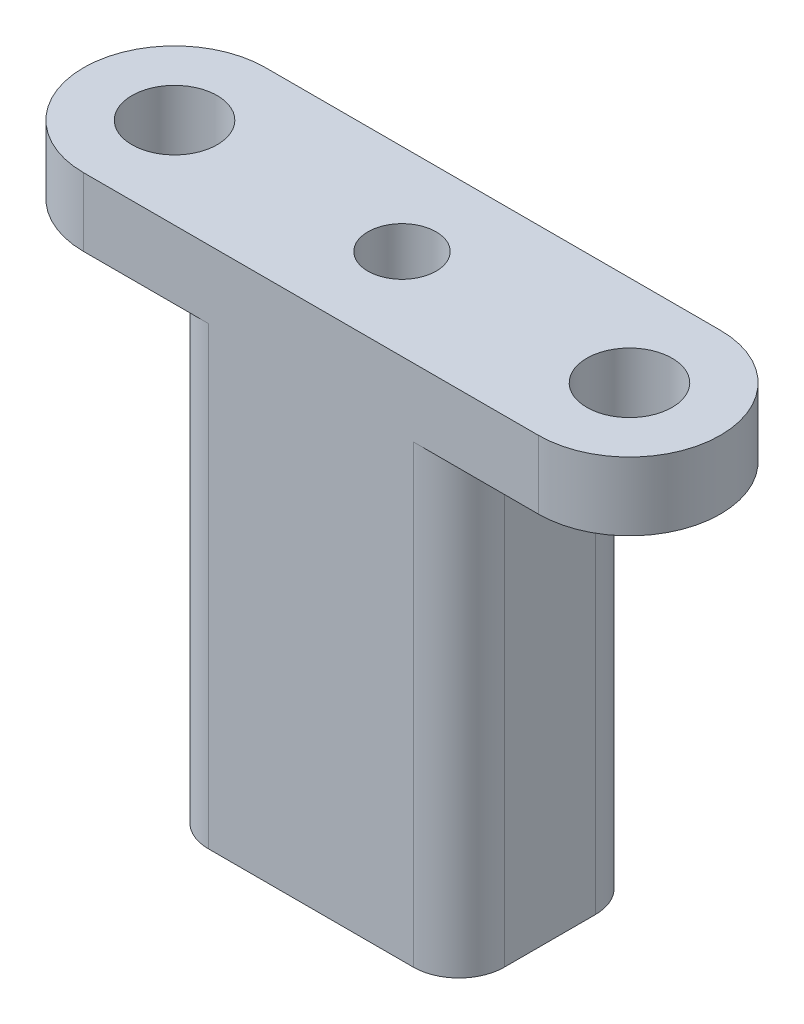
ISO-10303-21;
HEADER;
FILE_DESCRIPTION(('STEP AP214'),'2;1');
FILE_NAME('part.step','',(''),(''),'','','');
FILE_SCHEMA(('AUTOMOTIVE_DESIGN { 1 0 10303 214 1 1 1 1 }'));
ENDSEC;
DATA;
#1=APPLICATION_CONTEXT('core data for automotive mechanical design processes');
#2=APPLICATION_PROTOCOL_DEFINITION('international standard','automotive_design',2000,#1);
#3=PRODUCT_CONTEXT('',#1,'mechanical');
#4=PRODUCT('Part','Part','',(#3));
#5=PRODUCT_RELATED_PRODUCT_CATEGORY('part','',(#4));
#6=PRODUCT_DEFINITION_FORMATION('','',#4);
#7=PRODUCT_DEFINITION_CONTEXT('part definition',#1,'design');
#8=PRODUCT_DEFINITION('design','',#6,#7);
#9=PRODUCT_DEFINITION_SHAPE('','',#8);
#10=(LENGTH_UNIT() NAMED_UNIT(*) SI_UNIT(.MILLI.,.METRE.));
#11=(NAMED_UNIT(*) PLANE_ANGLE_UNIT() SI_UNIT($,.RADIAN.));
#12=(NAMED_UNIT(*) SI_UNIT($,.STERADIAN.) SOLID_ANGLE_UNIT());
#13=UNCERTAINTY_MEASURE_WITH_UNIT(LENGTH_MEASURE(1.E-05),#10,'distance_accuracy_value','');
#14=(GEOMETRIC_REPRESENTATION_CONTEXT(3) GLOBAL_UNCERTAINTY_ASSIGNED_CONTEXT((#13)) GLOBAL_UNIT_ASSIGNED_CONTEXT((#10,
#11,#12)) REPRESENTATION_CONTEXT('',''));
#15=CARTESIAN_POINT('',(0.,0.,0.));
#16=DIRECTION('',(0.,0.,1.));
#17=DIRECTION('',(1.,0.,0.));
#18=AXIS2_PLACEMENT_3D('',#15,#16,#17);
#19=CARTESIAN_POINT('',(9.99999999999999,0.,0.));
#20=DIRECTION('',(0.,1.,0.));
#21=DIRECTION('',(0.,0.,1.));
#22=AXIS2_PLACEMENT_3D('',#19,#20,#21);
#23=PLANE('',#22);
#24=CARTESIAN_POINT('',(9.99999999999999,0.,0.));
#25=DIRECTION('',(0.,1.,0.));
#26=DIRECTION('',(0.,0.,1.));
#27=AXIS2_PLACEMENT_3D('',#24,#25,#26);
#28=CIRCLE('',#27,1.875);
#29=CARTESIAN_POINT('',(9.99999999999999,0.,1.875));
#30=VERTEX_POINT('',#29);
#31=EDGE_CURVE('E211',#30,#30,#28,.T.);
#32=ORIENTED_EDGE('',*,*,#31,.T.);
#33=EDGE_LOOP('',(#32));
#34=FACE_BOUND('',#33,.T.);
#35=DIRECTION('',(0.,0.,1.));
#36=VECTOR('',#35,1.);
#37=CARTESIAN_POINT('',(6.5,0.,-4.));
#38=LINE('',#37,#36);
#39=CARTESIAN_POINT('',(6.5,0.,-2.));
#40=VERTEX_POINT('',#39);
#41=CARTESIAN_POINT('',(6.5,0.,2.));
#42=VERTEX_POINT('',#41);
#43=EDGE_CURVE('E190',#40,#42,#38,.T.);
#44=ORIENTED_EDGE('',*,*,#43,.F.);
#45=CARTESIAN_POINT('',(4.5,0.,-2.));
#46=DIRECTION('',(0.,1.,0.));
#47=DIRECTION('',(0.,0.,1.));
#48=AXIS2_PLACEMENT_3D('',#45,#46,#47);
#49=CIRCLE('',#48,2.);
#50=CARTESIAN_POINT('',(4.5,0.,-4.));
#51=VERTEX_POINT('',#50);
#52=EDGE_CURVE('E45',#40,#51,#49,.T.);
#53=ORIENTED_EDGE('',*,*,#52,.T.);
#54=DIRECTION('',(-1.,0.,0.));
#55=VECTOR('',#54,1.);
#56=CARTESIAN_POINT('',(-10.,0.,-4.));
#57=LINE('',#56,#55);
#58=CARTESIAN_POINT('',(9.99999999999999,0.,-4.));
#59=VERTEX_POINT('',#58);
#60=EDGE_CURVE('E52',#59,#51,#57,.T.);
#61=ORIENTED_EDGE('',*,*,#60,.F.);
#62=CARTESIAN_POINT('',(9.99999999999999,0.,0.));
#63=DIRECTION('',(0.,1.,0.));
#64=DIRECTION('',(0.,0.,1.));
#65=AXIS2_PLACEMENT_3D('',#62,#63,#64);
#66=CIRCLE('',#65,4.);
#67=CARTESIAN_POINT('',(9.99999999999999,0.,4.));
#68=VERTEX_POINT('',#67);
#69=EDGE_CURVE('E148',#68,#59,#66,.T.);
#70=ORIENTED_EDGE('',*,*,#69,.F.);
#71=DIRECTION('',(1.,0.,0.));
#72=VECTOR('',#71,1.);
#73=CARTESIAN_POINT('',(-10.,0.,4.));
#74=LINE('',#73,#72);
#75=CARTESIAN_POINT('',(4.5,0.,4.));
#76=VERTEX_POINT('',#75);
#77=EDGE_CURVE('E241',#76,#68,#74,.T.);
#78=ORIENTED_EDGE('',*,*,#77,.F.);
#79=CARTESIAN_POINT('',(4.5,0.,2.));
#80=DIRECTION('',(0.,1.,0.));
#81=DIRECTION('',(0.,0.,1.));
#82=AXIS2_PLACEMENT_3D('',#79,#80,#81);
#83=CIRCLE('',#82,2.);
#84=EDGE_CURVE('E185',#76,#42,#83,.T.);
#85=ORIENTED_EDGE('',*,*,#84,.T.);
#86=EDGE_LOOP('',(#44,#53,#61,#70,#78,#85));
#87=FACE_BOUND('',#86,.T.);
#88=ADVANCED_FACE('F37',(#34,#87),#23,.F.);
#89=CARTESIAN_POINT('',(-10.,0.,0.));
#90=DIRECTION('',(0.,1.,0.));
#91=DIRECTION('',(0.,0.,1.));
#92=AXIS2_PLACEMENT_3D('',#89,#90,#91);
#93=CIRCLE('',#92,1.875);
#94=CARTESIAN_POINT('',(-10.,0.,1.875));
#95=VERTEX_POINT('',#94);
#96=EDGE_CURVE('E226',#95,#95,#93,.T.);
#97=ORIENTED_EDGE('',*,*,#96,.T.);
#98=EDGE_LOOP('',(#97));
#99=FACE_BOUND('',#98,.T.);
#100=DIRECTION('',(0.,0.,-1.));
#101=VECTOR('',#100,1.);
#102=CARTESIAN_POINT('',(-6.5,0.,-4.));
#103=LINE('',#102,#101);
#104=CARTESIAN_POINT('',(-6.5,0.,2.));
#105=VERTEX_POINT('',#104);
#106=CARTESIAN_POINT('',(-6.5,0.,-2.));
#107=VERTEX_POINT('',#106);
#108=EDGE_CURVE('E218',#105,#107,#103,.T.);
#109=ORIENTED_EDGE('',*,*,#108,.F.);
#110=CARTESIAN_POINT('',(-4.5,0.,2.));
#111=DIRECTION('',(0.,1.,0.));
#112=DIRECTION('',(0.,0.,1.));
#113=AXIS2_PLACEMENT_3D('',#110,#111,#112);
#114=CIRCLE('',#113,2.);
#115=CARTESIAN_POINT('',(-4.5,0.,4.));
#116=VERTEX_POINT('',#115);
#117=EDGE_CURVE('E182',#105,#116,#114,.T.);
#118=ORIENTED_EDGE('',*,*,#117,.T.);
#119=CARTESIAN_POINT('',(-10.,0.,4.));
#120=VERTEX_POINT('',#119);
#121=EDGE_CURVE('E144',#120,#116,#74,.T.);
#122=ORIENTED_EDGE('',*,*,#121,.F.);
#123=CARTESIAN_POINT('',(-10.,0.,0.));
#124=DIRECTION('',(0.,1.,0.));
#125=DIRECTION('',(0.,0.,-1.));
#126=AXIS2_PLACEMENT_3D('',#123,#124,#125);
#127=CIRCLE('',#126,4.);
#128=CARTESIAN_POINT('',(-10.,0.,-4.));
#129=VERTEX_POINT('',#128);
#130=EDGE_CURVE('E239',#129,#120,#127,.T.);
#131=ORIENTED_EDGE('',*,*,#130,.F.);
#132=CARTESIAN_POINT('',(-4.5,0.,-4.));
#133=VERTEX_POINT('',#132);
#134=EDGE_CURVE('E59',#133,#129,#57,.T.);
#135=ORIENTED_EDGE('',*,*,#134,.F.);
#136=CARTESIAN_POINT('',(-4.5,0.,-2.));
#137=DIRECTION('',(0.,1.,0.));
#138=DIRECTION('',(0.,0.,1.));
#139=AXIS2_PLACEMENT_3D('',#136,#137,#138);
#140=CIRCLE('',#139,2.);
#141=EDGE_CURVE('E11',#133,#107,#140,.T.);
#142=ORIENTED_EDGE('',*,*,#141,.T.);
#143=EDGE_LOOP('',(#109,#118,#122,#131,#135,#142));
#144=FACE_BOUND('',#143,.T.);
#145=ADVANCED_FACE('F250',(#99,#144),#23,.F.);
#146=CARTESIAN_POINT('',(9.99999999999999,3.,0.));
#147=DIRECTION('',(0.,1.,0.));
#148=DIRECTION('',(0.,0.,1.));
#149=AXIS2_PLACEMENT_3D('',#146,#147,#148);
#150=PLANE('',#149);
#151=CARTESIAN_POINT('',(9.99999999999999,3.,0.));
#152=DIRECTION('',(0.,1.,0.));
#153=DIRECTION('',(0.,0.,1.));
#154=AXIS2_PLACEMENT_3D('',#151,#152,#153);
#155=CIRCLE('',#154,1.875);
#156=CARTESIAN_POINT('',(9.99999999999999,3.,1.875));
#157=VERTEX_POINT('',#156);
#158=EDGE_CURVE('E223',#157,#157,#155,.T.);
#159=ORIENTED_EDGE('',*,*,#158,.F.);
#160=EDGE_LOOP('',(#159));
#161=FACE_BOUND('',#160,.T.);
#162=CARTESIAN_POINT('',(9.99999999999999,3.,0.));
#163=DIRECTION('',(0.,1.,0.));
#164=DIRECTION('',(0.,0.,1.));
#165=AXIS2_PLACEMENT_3D('',#162,#163,#164);
#166=CIRCLE('',#165,4.);
#167=CARTESIAN_POINT('',(9.99999999999999,3.,4.));
#168=VERTEX_POINT('',#167);
#169=CARTESIAN_POINT('',(9.99999999999999,3.,-4.));
#170=VERTEX_POINT('',#169);
#171=EDGE_CURVE('E134',#168,#170,#166,.T.);
#172=ORIENTED_EDGE('',*,*,#171,.T.);
#173=DIRECTION('',(-1.,0.,0.));
#174=VECTOR('',#173,1.);
#175=CARTESIAN_POINT('',(-10.,3.,-4.));
#176=LINE('',#175,#174);
#177=CARTESIAN_POINT('',(-10.,3.,-4.));
#178=VERTEX_POINT('',#177);
#179=EDGE_CURVE('E123',#170,#178,#176,.T.);
#180=ORIENTED_EDGE('',*,*,#179,.T.);
#181=CARTESIAN_POINT('',(-10.,3.,0.));
#182=DIRECTION('',(0.,1.,0.));
#183=DIRECTION('',(0.,0.,-1.));
#184=AXIS2_PLACEMENT_3D('',#181,#182,#183);
#185=CIRCLE('',#184,4.);
#186=CARTESIAN_POINT('',(-10.,3.,4.));
#187=VERTEX_POINT('',#186);
#188=EDGE_CURVE('E133',#178,#187,#185,.T.);
#189=ORIENTED_EDGE('',*,*,#188,.T.);
#190=DIRECTION('',(1.,0.,0.));
#191=VECTOR('',#190,1.);
#192=CARTESIAN_POINT('',(-10.,3.,4.));
#193=LINE('',#192,#191);
#194=EDGE_CURVE('E140',#187,#168,#193,.T.);
#195=ORIENTED_EDGE('',*,*,#194,.T.);
#196=EDGE_LOOP('',(#172,#180,#189,#195));
#197=FACE_BOUND('',#196,.T.);
#198=CARTESIAN_POINT('',(-10.,3.,0.));
#199=DIRECTION('',(0.,1.,0.));
#200=DIRECTION('',(0.,0.,1.));
#201=AXIS2_PLACEMENT_3D('',#198,#199,#200);
#202=CIRCLE('',#201,1.875);
#203=CARTESIAN_POINT('',(-10.,3.,1.875));
#204=VERTEX_POINT('',#203);
#205=EDGE_CURVE('E229',#204,#204,#202,.T.);
#206=ORIENTED_EDGE('',*,*,#205,.F.);
#207=EDGE_LOOP('',(#206));
#208=FACE_BOUND('',#207,.T.);
#209=CARTESIAN_POINT('',(0.,3.,0.));
#210=DIRECTION('',(0.,1.,0.));
#211=DIRECTION('',(0.,0.,1.));
#212=AXIS2_PLACEMENT_3D('',#209,#210,#211);
#213=CIRCLE('',#212,1.5);
#214=CARTESIAN_POINT('',(0.,3.,1.5));
#215=VERTEX_POINT('',#214);
#216=EDGE_CURVE('E207',#215,#215,#213,.T.);
#217=ORIENTED_EDGE('',*,*,#216,.F.);
#218=EDGE_LOOP('',(#217));
#219=FACE_BOUND('',#218,.T.);
#220=ADVANCED_FACE('F137',(#161,#197,#208,#219),#150,.T.);
#221=CARTESIAN_POINT('',(9.99999999999999,3.,0.));
#222=DIRECTION('',(0.,-1.,0.));
#223=DIRECTION('',(0.,0.,-1.));
#224=AXIS2_PLACEMENT_3D('',#221,#222,#223);
#225=CYLINDRICAL_SURFACE('',#224,4.);
#226=ORIENTED_EDGE('',*,*,#69,.T.);
#227=DIRECTION('',(0.,-1.,0.));
#228=VECTOR('',#227,1.);
#229=CARTESIAN_POINT('',(9.99999999999999,3.,-4.));
#230=LINE('',#229,#228);
#231=EDGE_CURVE('E127',#170,#59,#230,.T.);
#232=ORIENTED_EDGE('',*,*,#231,.F.);
#233=ORIENTED_EDGE('',*,*,#171,.F.);
#234=DIRECTION('',(0.,-1.,0.));
#235=VECTOR('',#234,1.);
#236=CARTESIAN_POINT('',(9.99999999999999,3.,4.));
#237=LINE('',#236,#235);
#238=EDGE_CURVE('E236',#168,#68,#237,.T.);
#239=ORIENTED_EDGE('',*,*,#238,.T.);
#240=EDGE_LOOP('',(#226,#232,#233,#239));
#241=FACE_BOUND('',#240,.T.);
#242=ADVANCED_FACE('F146',(#241),#225,.T.);
#243=CARTESIAN_POINT('',(-10.,3.,-4.));
#244=DIRECTION('',(0.,0.,1.));
#245=DIRECTION('',(1.,0.,0.));
#246=AXIS2_PLACEMENT_3D('',#243,#244,#245);
#247=PLANE('',#246);
#248=ORIENTED_EDGE('',*,*,#60,.T.);
#249=DIRECTION('',(0.,1.,0.));
#250=VECTOR('',#249,1.);
#251=CARTESIAN_POINT('',(4.5,3.,-4.));
#252=LINE('',#251,#250);
#253=CARTESIAN_POINT('',(4.5,-20.,-4.));
#254=VERTEX_POINT('',#253);
#255=EDGE_CURVE('E180',#51,#254,#252,.F.);
#256=ORIENTED_EDGE('',*,*,#255,.T.);
#257=DIRECTION('',(1.,0.,0.));
#258=VECTOR('',#257,1.);
#259=CARTESIAN_POINT('',(-6.5,-20.,-4.));
#260=LINE('',#259,#258);
#261=CARTESIAN_POINT('',(-4.5,-20.,-4.));
#262=VERTEX_POINT('',#261);
#263=EDGE_CURVE('E197',#262,#254,#260,.T.);
#264=ORIENTED_EDGE('',*,*,#263,.F.);
#265=DIRECTION('',(0.,1.,0.));
#266=VECTOR('',#265,1.);
#267=CARTESIAN_POINT('',(-4.5,3.,-4.));
#268=LINE('',#267,#266);
#269=EDGE_CURVE('E177',#262,#133,#268,.T.);
#270=ORIENTED_EDGE('',*,*,#269,.T.);
#271=ORIENTED_EDGE('',*,*,#134,.T.);
#272=DIRECTION('',(0.,-1.,0.));
#273=VECTOR('',#272,1.);
#274=CARTESIAN_POINT('',(-10.,3.,-4.));
#275=LINE('',#274,#273);
#276=EDGE_CURVE('E130',#178,#129,#275,.T.);
#277=ORIENTED_EDGE('',*,*,#276,.F.);
#278=ORIENTED_EDGE('',*,*,#179,.F.);
#279=ORIENTED_EDGE('',*,*,#231,.T.);
#280=EDGE_LOOP('',(#248,#256,#264,#270,#271,#277,#278,#279));
#281=FACE_BOUND('',#280,.T.);
#282=ADVANCED_FACE('F125',(#281),#247,.F.);
#283=CARTESIAN_POINT('',(-10.,3.,0.));
#284=DIRECTION('',(0.,-1.,0.));
#285=DIRECTION('',(0.,0.,-1.));
#286=AXIS2_PLACEMENT_3D('',#283,#284,#285);
#287=CYLINDRICAL_SURFACE('',#286,4.);
#288=ORIENTED_EDGE('',*,*,#130,.T.);
#289=DIRECTION('',(0.,-1.,0.));
#290=VECTOR('',#289,1.);
#291=CARTESIAN_POINT('',(-10.,3.,4.));
#292=LINE('',#291,#290);
#293=EDGE_CURVE('E153',#187,#120,#292,.T.);
#294=ORIENTED_EDGE('',*,*,#293,.F.);
#295=ORIENTED_EDGE('',*,*,#188,.F.);
#296=ORIENTED_EDGE('',*,*,#276,.T.);
#297=EDGE_LOOP('',(#288,#294,#295,#296));
#298=FACE_BOUND('',#297,.T.);
#299=ADVANCED_FACE('F293',(#298),#287,.T.);
#300=CARTESIAN_POINT('',(-10.,3.,4.));
#301=DIRECTION('',(0.,0.,-1.));
#302=DIRECTION('',(-1.,0.,0.));
#303=AXIS2_PLACEMENT_3D('',#300,#301,#302);
#304=PLANE('',#303);
#305=ORIENTED_EDGE('',*,*,#121,.T.);
#306=DIRECTION('',(0.,1.,0.));
#307=VECTOR('',#306,1.);
#308=CARTESIAN_POINT('',(-4.5,3.,4.));
#309=LINE('',#308,#307);
#310=CARTESIAN_POINT('',(-4.5,-20.,4.));
#311=VERTEX_POINT('',#310);
#312=EDGE_CURVE('E162',#116,#311,#309,.F.);
#313=ORIENTED_EDGE('',*,*,#312,.T.);
#314=DIRECTION('',(-1.,0.,0.));
#315=VECTOR('',#314,1.);
#316=CARTESIAN_POINT('',(-6.5,-20.,4.));
#317=LINE('',#316,#315);
#318=CARTESIAN_POINT('',(4.5,-20.,4.));
#319=VERTEX_POINT('',#318);
#320=EDGE_CURVE('E213',#319,#311,#317,.T.);
#321=ORIENTED_EDGE('',*,*,#320,.F.);
#322=DIRECTION('',(0.,1.,0.));
#323=VECTOR('',#322,1.);
#324=CARTESIAN_POINT('',(4.5,3.,4.));
#325=LINE('',#324,#323);
#326=EDGE_CURVE('E159',#319,#76,#325,.T.);
#327=ORIENTED_EDGE('',*,*,#326,.T.);
#328=ORIENTED_EDGE('',*,*,#77,.T.);
#329=ORIENTED_EDGE('',*,*,#238,.F.);
#330=ORIENTED_EDGE('',*,*,#194,.F.);
#331=ORIENTED_EDGE('',*,*,#293,.T.);
#332=EDGE_LOOP('',(#305,#313,#321,#327,#328,#329,#330,#331));
#333=FACE_BOUND('',#332,.T.);
#334=ADVANCED_FACE('F247',(#333),#304,.F.);
#335=CARTESIAN_POINT('',(-10.,3.,0.));
#336=DIRECTION('',(0.,-1.,0.));
#337=DIRECTION('',(0.,0.,-1.));
#338=AXIS2_PLACEMENT_3D('',#335,#336,#337);
#339=CYLINDRICAL_SURFACE('',#338,1.875);
#340=ORIENTED_EDGE('',*,*,#205,.T.);
#341=EDGE_LOOP('',(#340));
#342=FACE_BOUND('',#341,.T.);
#343=ORIENTED_EDGE('',*,*,#96,.F.);
#344=EDGE_LOOP('',(#343));
#345=FACE_BOUND('',#344,.T.);
#346=ADVANCED_FACE('F292',(#342,#345),#339,.F.);
#347=CARTESIAN_POINT('',(9.99999999999999,3.,0.));
#348=DIRECTION('',(0.,-1.,0.));
#349=DIRECTION('',(0.,0.,-1.));
#350=AXIS2_PLACEMENT_3D('',#347,#348,#349);
#351=CYLINDRICAL_SURFACE('',#350,1.875);
#352=ORIENTED_EDGE('',*,*,#158,.T.);
#353=EDGE_LOOP('',(#352));
#354=FACE_BOUND('',#353,.T.);
#355=ORIENTED_EDGE('',*,*,#31,.F.);
#356=EDGE_LOOP('',(#355));
#357=FACE_BOUND('',#356,.T.);
#358=ADVANCED_FACE('F276',(#354,#357),#351,.F.);
#359=CARTESIAN_POINT('',(0.,3.,0.));
#360=DIRECTION('',(0.,-1.,0.));
#361=DIRECTION('',(0.,0.,-1.));
#362=AXIS2_PLACEMENT_3D('',#359,#360,#361);
#363=CYLINDRICAL_SURFACE('',#362,1.5);
#364=ORIENTED_EDGE('',*,*,#216,.T.);
#365=EDGE_LOOP('',(#364));
#366=FACE_BOUND('',#365,.T.);
#367=CARTESIAN_POINT('',(0.,-20.,0.));
#368=DIRECTION('',(0.,-1.,0.));
#369=DIRECTION('',(0.,0.,-1.));
#370=AXIS2_PLACEMENT_3D('',#367,#368,#369);
#371=CIRCLE('',#370,1.5);
#372=CARTESIAN_POINT('',(0.,-20.,-1.5));
#373=VERTEX_POINT('',#372);
#374=EDGE_CURVE('E219',#373,#373,#371,.T.);
#375=ORIENTED_EDGE('',*,*,#374,.T.);
#376=EDGE_LOOP('',(#375));
#377=FACE_BOUND('',#376,.T.);
#378=ADVANCED_FACE('F265',(#366,#377),#363,.F.);
#379=CARTESIAN_POINT('',(0.,-20.,0.));
#380=DIRECTION('',(0.,1.,0.));
#381=DIRECTION('',(0.,0.,1.));
#382=AXIS2_PLACEMENT_3D('',#379,#380,#381);
#383=PLANE('',#382);
#384=ORIENTED_EDGE('',*,*,#320,.T.);
#385=CARTESIAN_POINT('',(-4.5,-20.,2.));
#386=DIRECTION('',(0.,1.,0.));
#387=DIRECTION('',(0.,0.,1.));
#388=AXIS2_PLACEMENT_3D('',#385,#386,#387);
#389=CIRCLE('',#388,2.);
#390=CARTESIAN_POINT('',(-6.5,-20.,2.));
#391=VERTEX_POINT('',#390);
#392=EDGE_CURVE('E170',#311,#391,#389,.F.);
#393=ORIENTED_EDGE('',*,*,#392,.T.);
#394=DIRECTION('',(0.,0.,-1.));
#395=VECTOR('',#394,1.);
#396=CARTESIAN_POINT('',(-6.5,-20.,-4.));
#397=LINE('',#396,#395);
#398=CARTESIAN_POINT('',(-6.5,-20.,-2.));
#399=VERTEX_POINT('',#398);
#400=EDGE_CURVE('E208',#391,#399,#397,.T.);
#401=ORIENTED_EDGE('',*,*,#400,.T.);
#402=CARTESIAN_POINT('',(-4.5,-20.,-2.));
#403=DIRECTION('',(0.,1.,0.));
#404=DIRECTION('',(0.,0.,1.));
#405=AXIS2_PLACEMENT_3D('',#402,#403,#404);
#406=CIRCLE('',#405,2.);
#407=EDGE_CURVE('E164',#399,#262,#406,.F.);
#408=ORIENTED_EDGE('',*,*,#407,.T.);
#409=ORIENTED_EDGE('',*,*,#263,.T.);
#410=CARTESIAN_POINT('',(4.5,-20.,-2.));
#411=DIRECTION('',(0.,1.,0.));
#412=DIRECTION('',(0.,0.,1.));
#413=AXIS2_PLACEMENT_3D('',#410,#411,#412);
#414=CIRCLE('',#413,2.);
#415=CARTESIAN_POINT('',(6.5,-20.,-2.));
#416=VERTEX_POINT('',#415);
#417=EDGE_CURVE('E166',#254,#416,#414,.F.);
#418=ORIENTED_EDGE('',*,*,#417,.T.);
#419=DIRECTION('',(0.,0.,1.));
#420=VECTOR('',#419,1.);
#421=CARTESIAN_POINT('',(6.5,-20.,-4.));
#422=LINE('',#421,#420);
#423=CARTESIAN_POINT('',(6.5,-20.,2.));
#424=VERTEX_POINT('',#423);
#425=EDGE_CURVE('E221',#416,#424,#422,.T.);
#426=ORIENTED_EDGE('',*,*,#425,.T.);
#427=CARTESIAN_POINT('',(4.5,-20.,2.));
#428=DIRECTION('',(0.,1.,0.));
#429=DIRECTION('',(0.,0.,1.));
#430=AXIS2_PLACEMENT_3D('',#427,#428,#429);
#431=CIRCLE('',#430,2.);
#432=EDGE_CURVE('E168',#424,#319,#431,.F.);
#433=ORIENTED_EDGE('',*,*,#432,.T.);
#434=EDGE_LOOP('',(#384,#393,#401,#408,#409,#418,#426,#433));
#435=FACE_BOUND('',#434,.T.);
#436=ORIENTED_EDGE('',*,*,#374,.F.);
#437=EDGE_LOOP('',(#436));
#438=FACE_BOUND('',#437,.T.);
#439=ADVANCED_FACE('F201',(#435,#438),#383,.F.);
#440=CARTESIAN_POINT('',(6.5,-20.,-4.));
#441=DIRECTION('',(-1.,0.,0.));
#442=DIRECTION('',(0.,0.,1.));
#443=AXIS2_PLACEMENT_3D('',#440,#441,#442);
#444=PLANE('',#443);
#445=ORIENTED_EDGE('',*,*,#43,.T.);
#446=DIRECTION('',(0.,1.,0.));
#447=VECTOR('',#446,1.);
#448=CARTESIAN_POINT('',(6.5,-20.,2.));
#449=LINE('',#448,#447);
#450=EDGE_CURVE('E175',#42,#424,#449,.F.);
#451=ORIENTED_EDGE('',*,*,#450,.T.);
#452=ORIENTED_EDGE('',*,*,#425,.F.);
#453=DIRECTION('',(0.,1.,0.));
#454=VECTOR('',#453,1.);
#455=CARTESIAN_POINT('',(6.5,-20.,-2.));
#456=LINE('',#455,#454);
#457=EDGE_CURVE('E172',#416,#40,#456,.T.);
#458=ORIENTED_EDGE('',*,*,#457,.T.);
#459=EDGE_LOOP('',(#445,#451,#452,#458));
#460=FACE_BOUND('',#459,.T.);
#461=ADVANCED_FACE('F267',(#460),#444,.F.);
#462=CARTESIAN_POINT('',(-6.5,-20.,-4.));
#463=DIRECTION('',(1.,0.,0.));
#464=DIRECTION('',(0.,0.,-1.));
#465=AXIS2_PLACEMENT_3D('',#462,#463,#464);
#466=PLANE('',#465);
#467=ORIENTED_EDGE('',*,*,#400,.F.);
#468=DIRECTION('',(0.,1.,0.));
#469=VECTOR('',#468,1.);
#470=CARTESIAN_POINT('',(-6.5,-20.,2.));
#471=LINE('',#470,#469);
#472=EDGE_CURVE('E151',#391,#105,#471,.T.);
#473=ORIENTED_EDGE('',*,*,#472,.T.);
#474=ORIENTED_EDGE('',*,*,#108,.T.);
#475=DIRECTION('',(0.,1.,0.));
#476=VECTOR('',#475,1.);
#477=CARTESIAN_POINT('',(-6.5,-20.,-2.));
#478=LINE('',#477,#476);
#479=EDGE_CURVE('E149',#107,#399,#478,.F.);
#480=ORIENTED_EDGE('',*,*,#479,.T.);
#481=EDGE_LOOP('',(#467,#473,#474,#480));
#482=FACE_BOUND('',#481,.T.);
#483=ADVANCED_FACE('F273',(#482),#466,.F.);
#484=CARTESIAN_POINT('',(-4.5,-20.,2.));
#485=DIRECTION('',(0.,1.,0.));
#486=DIRECTION('',(0.,0.,1.));
#487=AXIS2_PLACEMENT_3D('',#484,#485,#486);
#488=CYLINDRICAL_SURFACE('',#487,2.);
#489=ORIENTED_EDGE('',*,*,#392,.F.);
#490=ORIENTED_EDGE('',*,*,#312,.F.);
#491=ORIENTED_EDGE('',*,*,#117,.F.);
#492=ORIENTED_EDGE('',*,*,#472,.F.);
#493=EDGE_LOOP('',(#489,#490,#491,#492));
#494=FACE_BOUND('',#493,.T.);
#495=ADVANCED_FACE('F255',(#494),#488,.T.);
#496=CARTESIAN_POINT('',(4.5,3.,2.));
#497=DIRECTION('',(0.,1.,0.));
#498=DIRECTION('',(0.,0.,1.));
#499=AXIS2_PLACEMENT_3D('',#496,#497,#498);
#500=CYLINDRICAL_SURFACE('',#499,2.);
#501=ORIENTED_EDGE('',*,*,#432,.F.);
#502=ORIENTED_EDGE('',*,*,#450,.F.);
#503=ORIENTED_EDGE('',*,*,#84,.F.);
#504=ORIENTED_EDGE('',*,*,#326,.F.);
#505=EDGE_LOOP('',(#501,#502,#503,#504));
#506=FACE_BOUND('',#505,.T.);
#507=ADVANCED_FACE('F302',(#506),#500,.T.);
#508=CARTESIAN_POINT('',(4.5,-20.,-2.));
#509=DIRECTION('',(0.,1.,0.));
#510=DIRECTION('',(0.,0.,1.));
#511=AXIS2_PLACEMENT_3D('',#508,#509,#510);
#512=CYLINDRICAL_SURFACE('',#511,2.);
#513=ORIENTED_EDGE('',*,*,#417,.F.);
#514=ORIENTED_EDGE('',*,*,#255,.F.);
#515=ORIENTED_EDGE('',*,*,#52,.F.);
#516=ORIENTED_EDGE('',*,*,#457,.F.);
#517=EDGE_LOOP('',(#513,#514,#515,#516));
#518=FACE_BOUND('',#517,.T.);
#519=ADVANCED_FACE('F194',(#518),#512,.T.);
#520=CARTESIAN_POINT('',(-4.5,3.,-2.));
#521=DIRECTION('',(0.,1.,0.));
#522=DIRECTION('',(0.,0.,1.));
#523=AXIS2_PLACEMENT_3D('',#520,#521,#522);
#524=CYLINDRICAL_SURFACE('',#523,2.);
#525=ORIENTED_EDGE('',*,*,#407,.F.);
#526=ORIENTED_EDGE('',*,*,#479,.F.);
#527=ORIENTED_EDGE('',*,*,#141,.F.);
#528=ORIENTED_EDGE('',*,*,#269,.F.);
#529=EDGE_LOOP('',(#525,#526,#527,#528));
#530=FACE_BOUND('',#529,.T.);
#531=ADVANCED_FACE('F39',(#530),#524,.T.);
#532=CLOSED_SHELL('',(#88,#145,#220,#242,#282,#299,#334,#346,#358,#378,#439,#461,#483,#495,#507,
#519,#531));
#533=MANIFOLD_SOLID_BREP('B2',#532);
#534=ADVANCED_BREP_SHAPE_REPRESENTATION('',(#18,#533),#14);
#535=SHAPE_DEFINITION_REPRESENTATION(#9,#534);
ENDSEC;
END-ISO-10303-21;
